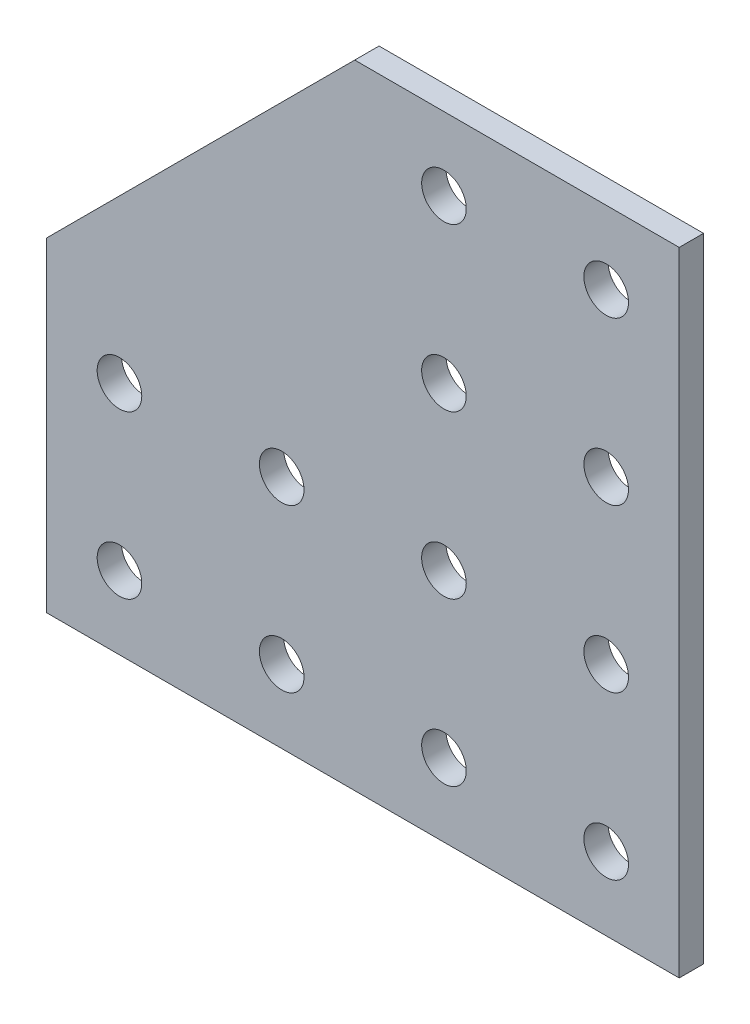
ISO-10303-21;
HEADER;
FILE_DESCRIPTION(('STEP AP214'),'2;1');
FILE_NAME('part.step','',(''),(''),'','','');
FILE_SCHEMA(('AUTOMOTIVE_DESIGN { 1 0 10303 214 1 1 1 1 }'));
ENDSEC;
DATA;
#1=APPLICATION_CONTEXT('core data for automotive mechanical design processes');
#2=APPLICATION_PROTOCOL_DEFINITION('international standard','automotive_design',2000,#1);
#3=PRODUCT_CONTEXT('',#1,'mechanical');
#4=PRODUCT('Part','Part','',(#3));
#5=PRODUCT_RELATED_PRODUCT_CATEGORY('part','',(#4));
#6=PRODUCT_DEFINITION_FORMATION('','',#4);
#7=PRODUCT_DEFINITION_CONTEXT('part definition',#1,'design');
#8=PRODUCT_DEFINITION('design','',#6,#7);
#9=PRODUCT_DEFINITION_SHAPE('','',#8);
#10=(LENGTH_UNIT() NAMED_UNIT(*) SI_UNIT(.MILLI.,.METRE.));
#11=(NAMED_UNIT(*) PLANE_ANGLE_UNIT() SI_UNIT($,.RADIAN.));
#12=(NAMED_UNIT(*) SI_UNIT($,.STERADIAN.) SOLID_ANGLE_UNIT());
#13=UNCERTAINTY_MEASURE_WITH_UNIT(LENGTH_MEASURE(1.E-05),#10,'distance_accuracy_value','');
#14=(GEOMETRIC_REPRESENTATION_CONTEXT(3) GLOBAL_UNCERTAINTY_ASSIGNED_CONTEXT((#13)) GLOBAL_UNIT_ASSIGNED_CONTEXT((#10,
#11,#12)) REPRESENTATION_CONTEXT('',''));
#15=CARTESIAN_POINT('',(0.,0.,0.));
#16=DIRECTION('',(0.,0.,1.));
#17=DIRECTION('',(1.,0.,0.));
#18=AXIS2_PLACEMENT_3D('',#15,#16,#17);
#19=CARTESIAN_POINT('',(0.,0.,3.));
#20=DIRECTION('',(0.,0.,-1.));
#21=DIRECTION('',(-1.,0.,0.));
#22=AXIS2_PLACEMENT_3D('',#19,#20,#21);
#23=PLANE('',#22);
#24=DIRECTION('',(1.,0.,0.));
#25=VECTOR('',#24,1.);
#26=CARTESIAN_POINT('',(78.,0.,3.));
#27=LINE('',#26,#25);
#28=CARTESIAN_POINT('',(0.,0.,3.));
#29=VERTEX_POINT('',#28);
#30=CARTESIAN_POINT('',(78.,0.,3.));
#31=VERTEX_POINT('',#30);
#32=EDGE_CURVE('E117',#29,#31,#27,.T.);
#33=ORIENTED_EDGE('',*,*,#32,.T.);
#34=DIRECTION('',(0.,1.,0.));
#35=VECTOR('',#34,1.);
#36=CARTESIAN_POINT('',(78.,78.,3.));
#37=LINE('',#36,#35);
#38=CARTESIAN_POINT('',(78.,78.,3.));
#39=VERTEX_POINT('',#38);
#40=EDGE_CURVE('E84',#31,#39,#37,.T.);
#41=ORIENTED_EDGE('',*,*,#40,.T.);
#42=DIRECTION('',(-1.,0.,0.));
#43=VECTOR('',#42,1.);
#44=CARTESIAN_POINT('',(38.,78.,3.));
#45=LINE('',#44,#43);
#46=CARTESIAN_POINT('',(38.,78.,3.));
#47=VERTEX_POINT('',#46);
#48=EDGE_CURVE('E88',#39,#47,#45,.T.);
#49=ORIENTED_EDGE('',*,*,#48,.T.);
#50=DIRECTION('',(-0.707106781186548,-0.707106781186548,0.));
#51=VECTOR('',#50,1.);
#52=CARTESIAN_POINT('',(0.,40.,3.));
#53=LINE('',#52,#51);
#54=CARTESIAN_POINT('',(0.,40.,3.));
#55=VERTEX_POINT('',#54);
#56=EDGE_CURVE('E92',#47,#55,#53,.T.);
#57=ORIENTED_EDGE('',*,*,#56,.T.);
#58=DIRECTION('',(0.,-1.,0.));
#59=VECTOR('',#58,1.);
#60=CARTESIAN_POINT('',(0.,0.,3.));
#61=LINE('',#60,#59);
#62=EDGE_CURVE('E50',#55,#29,#61,.T.);
#63=ORIENTED_EDGE('',*,*,#62,.T.);
#64=EDGE_LOOP('',(#33,#41,#49,#57,#63));
#65=FACE_BOUND('',#64,.T.);
#66=CARTESIAN_POINT('',(8.99999999999999,29.,3.));
#67=DIRECTION('',(0.,0.,1.));
#68=DIRECTION('',(1.,0.,0.));
#69=AXIS2_PLACEMENT_3D('',#66,#67,#68);
#70=CIRCLE('',#69,2.75);
#71=CARTESIAN_POINT('',(11.75,29.,3.));
#72=VERTEX_POINT('',#71);
#73=EDGE_CURVE('E112',#72,#72,#70,.T.);
#74=ORIENTED_EDGE('',*,*,#73,.F.);
#75=EDGE_LOOP('',(#74));
#76=FACE_BOUND('',#75,.T.);
#77=CARTESIAN_POINT('',(8.99999999999999,8.99999999999999,3.));
#78=DIRECTION('',(0.,0.,1.));
#79=DIRECTION('',(-1.,0.,0.));
#80=AXIS2_PLACEMENT_3D('',#77,#78,#79);
#81=CIRCLE('',#80,2.75);
#82=CARTESIAN_POINT('',(6.25,8.99999999999999,3.));
#83=VERTEX_POINT('',#82);
#84=EDGE_CURVE('E256',#83,#83,#81,.T.);
#85=ORIENTED_EDGE('',*,*,#84,.F.);
#86=EDGE_LOOP('',(#85));
#87=FACE_BOUND('',#86,.T.);
#88=CARTESIAN_POINT('',(29.,8.99999999999999,3.));
#89=DIRECTION('',(0.,0.,1.));
#90=DIRECTION('',(1.,0.,0.));
#91=AXIS2_PLACEMENT_3D('',#88,#89,#90);
#92=CIRCLE('',#91,2.75);
#93=CARTESIAN_POINT('',(31.75,8.99999999999999,3.));
#94=VERTEX_POINT('',#93);
#95=EDGE_CURVE('E250',#94,#94,#92,.T.);
#96=ORIENTED_EDGE('',*,*,#95,.F.);
#97=EDGE_LOOP('',(#96));
#98=FACE_BOUND('',#97,.T.);
#99=CARTESIAN_POINT('',(29.,29.,3.));
#100=DIRECTION('',(0.,0.,1.));
#101=DIRECTION('',(-1.,0.,0.));
#102=AXIS2_PLACEMENT_3D('',#99,#100,#101);
#103=CIRCLE('',#102,2.75);
#104=CARTESIAN_POINT('',(26.25,29.,3.));
#105=VERTEX_POINT('',#104);
#106=EDGE_CURVE('E244',#105,#105,#103,.T.);
#107=ORIENTED_EDGE('',*,*,#106,.F.);
#108=EDGE_LOOP('',(#107));
#109=FACE_BOUND('',#108,.T.);
#110=CARTESIAN_POINT('',(49.,29.,3.));
#111=DIRECTION('',(0.,0.,1.));
#112=DIRECTION('',(1.,0.,0.));
#113=AXIS2_PLACEMENT_3D('',#110,#111,#112);
#114=CIRCLE('',#113,2.74999999999999);
#115=CARTESIAN_POINT('',(51.75,29.,3.));
#116=VERTEX_POINT('',#115);
#117=EDGE_CURVE('E238',#116,#116,#114,.T.);
#118=ORIENTED_EDGE('',*,*,#117,.F.);
#119=EDGE_LOOP('',(#118));
#120=FACE_BOUND('',#119,.T.);
#121=CARTESIAN_POINT('',(49.,8.99999999999999,3.));
#122=DIRECTION('',(0.,0.,1.));
#123=DIRECTION('',(-1.,0.,0.));
#124=AXIS2_PLACEMENT_3D('',#121,#122,#123);
#125=CIRCLE('',#124,2.74999999999999);
#126=CARTESIAN_POINT('',(46.25,8.99999999999999,3.));
#127=VERTEX_POINT('',#126);
#128=EDGE_CURVE('E232',#127,#127,#125,.T.);
#129=ORIENTED_EDGE('',*,*,#128,.F.);
#130=EDGE_LOOP('',(#129));
#131=FACE_BOUND('',#130,.T.);
#132=CARTESIAN_POINT('',(69.,8.99999999999999,3.));
#133=DIRECTION('',(0.,0.,1.));
#134=DIRECTION('',(1.,0.,0.));
#135=AXIS2_PLACEMENT_3D('',#132,#133,#134);
#136=CIRCLE('',#135,2.74999999999999);
#137=CARTESIAN_POINT('',(71.75,8.99999999999999,3.));
#138=VERTEX_POINT('',#137);
#139=EDGE_CURVE('E226',#138,#138,#136,.T.);
#140=ORIENTED_EDGE('',*,*,#139,.F.);
#141=EDGE_LOOP('',(#140));
#142=FACE_BOUND('',#141,.T.);
#143=CARTESIAN_POINT('',(69.,29.,3.));
#144=DIRECTION('',(0.,0.,1.));
#145=DIRECTION('',(1.,0.,0.));
#146=AXIS2_PLACEMENT_3D('',#143,#144,#145);
#147=CIRCLE('',#146,2.75);
#148=CARTESIAN_POINT('',(71.75,29.,3.));
#149=VERTEX_POINT('',#148);
#150=EDGE_CURVE('E220',#149,#149,#147,.T.);
#151=ORIENTED_EDGE('',*,*,#150,.F.);
#152=EDGE_LOOP('',(#151));
#153=FACE_BOUND('',#152,.T.);
#154=CARTESIAN_POINT('',(49.,49.,3.));
#155=DIRECTION('',(0.,0.,1.));
#156=DIRECTION('',(1.,0.,0.));
#157=AXIS2_PLACEMENT_3D('',#154,#155,#156);
#158=CIRCLE('',#157,2.74999999999999);
#159=CARTESIAN_POINT('',(51.75,49.,3.));
#160=VERTEX_POINT('',#159);
#161=EDGE_CURVE('E214',#160,#160,#158,.T.);
#162=ORIENTED_EDGE('',*,*,#161,.F.);
#163=EDGE_LOOP('',(#162));
#164=FACE_BOUND('',#163,.T.);
#165=CARTESIAN_POINT('',(69.,49.,3.));
#166=DIRECTION('',(0.,0.,1.));
#167=DIRECTION('',(-1.,0.,0.));
#168=AXIS2_PLACEMENT_3D('',#165,#166,#167);
#169=CIRCLE('',#168,2.74999999999999);
#170=CARTESIAN_POINT('',(66.25,49.,3.));
#171=VERTEX_POINT('',#170);
#172=EDGE_CURVE('E208',#171,#171,#169,.T.);
#173=ORIENTED_EDGE('',*,*,#172,.F.);
#174=EDGE_LOOP('',(#173));
#175=FACE_BOUND('',#174,.T.);
#176=CARTESIAN_POINT('',(69.,69.,3.));
#177=DIRECTION('',(0.,0.,1.));
#178=DIRECTION('',(1.,0.,0.));
#179=AXIS2_PLACEMENT_3D('',#176,#177,#178);
#180=CIRCLE('',#179,2.74999999999998);
#181=CARTESIAN_POINT('',(71.75,69.,3.));
#182=VERTEX_POINT('',#181);
#183=EDGE_CURVE('E202',#182,#182,#180,.T.);
#184=ORIENTED_EDGE('',*,*,#183,.F.);
#185=EDGE_LOOP('',(#184));
#186=FACE_BOUND('',#185,.T.);
#187=CARTESIAN_POINT('',(49.,69.,3.));
#188=DIRECTION('',(0.,0.,1.));
#189=DIRECTION('',(-1.,0.,0.));
#190=AXIS2_PLACEMENT_3D('',#187,#188,#189);
#191=CIRCLE('',#190,2.75);
#192=CARTESIAN_POINT('',(46.25,69.,3.));
#193=VERTEX_POINT('',#192);
#194=EDGE_CURVE('E193',#193,#193,#191,.T.);
#195=ORIENTED_EDGE('',*,*,#194,.F.);
#196=EDGE_LOOP('',(#195));
#197=FACE_BOUND('',#196,.T.);
#198=ADVANCED_FACE('F33',(#65,#76,#87,#98,#109,#120,#131,#142,#153,#164,#175,#186,#197),#23,.F.);
#199=CARTESIAN_POINT('',(0.,0.,0.));
#200=DIRECTION('',(0.,0.,-1.));
#201=DIRECTION('',(-1.,0.,0.));
#202=AXIS2_PLACEMENT_3D('',#199,#200,#201);
#203=PLANE('',#202);
#204=CARTESIAN_POINT('',(69.,69.,0.));
#205=DIRECTION('',(0.,0.,1.));
#206=DIRECTION('',(1.,0.,0.));
#207=AXIS2_PLACEMENT_3D('',#204,#205,#206);
#208=CIRCLE('',#207,2.74999999999998);
#209=CARTESIAN_POINT('',(71.75,69.,0.));
#210=VERTEX_POINT('',#209);
#211=EDGE_CURVE('E199',#210,#210,#208,.T.);
#212=ORIENTED_EDGE('',*,*,#211,.T.);
#213=EDGE_LOOP('',(#212));
#214=FACE_BOUND('',#213,.T.);
#215=CARTESIAN_POINT('',(49.,49.,0.));
#216=DIRECTION('',(0.,0.,1.));
#217=DIRECTION('',(1.,0.,0.));
#218=AXIS2_PLACEMENT_3D('',#215,#216,#217);
#219=CIRCLE('',#218,2.74999999999999);
#220=CARTESIAN_POINT('',(51.75,49.,0.));
#221=VERTEX_POINT('',#220);
#222=EDGE_CURVE('E211',#221,#221,#219,.T.);
#223=ORIENTED_EDGE('',*,*,#222,.T.);
#224=EDGE_LOOP('',(#223));
#225=FACE_BOUND('',#224,.T.);
#226=CARTESIAN_POINT('',(69.,8.99999999999999,0.));
#227=DIRECTION('',(0.,0.,1.));
#228=DIRECTION('',(1.,0.,0.));
#229=AXIS2_PLACEMENT_3D('',#226,#227,#228);
#230=CIRCLE('',#229,2.74999999999999);
#231=CARTESIAN_POINT('',(71.75,8.99999999999999,0.));
#232=VERTEX_POINT('',#231);
#233=EDGE_CURVE('E223',#232,#232,#230,.T.);
#234=ORIENTED_EDGE('',*,*,#233,.T.);
#235=EDGE_LOOP('',(#234));
#236=FACE_BOUND('',#235,.T.);
#237=CARTESIAN_POINT('',(49.,29.,0.));
#238=DIRECTION('',(0.,0.,1.));
#239=DIRECTION('',(1.,0.,0.));
#240=AXIS2_PLACEMENT_3D('',#237,#238,#239);
#241=CIRCLE('',#240,2.74999999999999);
#242=CARTESIAN_POINT('',(51.75,29.,0.));
#243=VERTEX_POINT('',#242);
#244=EDGE_CURVE('E235',#243,#243,#241,.T.);
#245=ORIENTED_EDGE('',*,*,#244,.T.);
#246=EDGE_LOOP('',(#245));
#247=FACE_BOUND('',#246,.T.);
#248=CARTESIAN_POINT('',(29.,8.99999999999999,0.));
#249=DIRECTION('',(0.,0.,1.));
#250=DIRECTION('',(1.,0.,0.));
#251=AXIS2_PLACEMENT_3D('',#248,#249,#250);
#252=CIRCLE('',#251,2.75);
#253=CARTESIAN_POINT('',(31.75,8.99999999999999,0.));
#254=VERTEX_POINT('',#253);
#255=EDGE_CURVE('E247',#254,#254,#252,.T.);
#256=ORIENTED_EDGE('',*,*,#255,.T.);
#257=EDGE_LOOP('',(#256));
#258=FACE_BOUND('',#257,.T.);
#259=CARTESIAN_POINT('',(8.99999999999999,29.,0.));
#260=DIRECTION('',(0.,0.,1.));
#261=DIRECTION('',(1.,0.,0.));
#262=AXIS2_PLACEMENT_3D('',#259,#260,#261);
#263=CIRCLE('',#262,2.75);
#264=CARTESIAN_POINT('',(11.75,29.,0.));
#265=VERTEX_POINT('',#264);
#266=EDGE_CURVE('E259',#265,#265,#263,.T.);
#267=ORIENTED_EDGE('',*,*,#266,.T.);
#268=EDGE_LOOP('',(#267));
#269=FACE_BOUND('',#268,.T.);
#270=DIRECTION('',(1.,0.,0.));
#271=VECTOR('',#270,1.);
#272=CARTESIAN_POINT('',(78.,0.,0.));
#273=LINE('',#272,#271);
#274=CARTESIAN_POINT('',(0.,0.,0.));
#275=VERTEX_POINT('',#274);
#276=CARTESIAN_POINT('',(78.,0.,0.));
#277=VERTEX_POINT('',#276);
#278=EDGE_CURVE('E108',#275,#277,#273,.T.);
#279=ORIENTED_EDGE('',*,*,#278,.F.);
#280=DIRECTION('',(0.,-1.,0.));
#281=VECTOR('',#280,1.);
#282=CARTESIAN_POINT('',(0.,0.,0.));
#283=LINE('',#282,#281);
#284=CARTESIAN_POINT('',(0.,40.,0.));
#285=VERTEX_POINT('',#284);
#286=EDGE_CURVE('E76',#285,#275,#283,.T.);
#287=ORIENTED_EDGE('',*,*,#286,.F.);
#288=DIRECTION('',(-0.707106781186548,-0.707106781186548,0.));
#289=VECTOR('',#288,1.);
#290=CARTESIAN_POINT('',(0.,40.,0.));
#291=LINE('',#290,#289);
#292=CARTESIAN_POINT('',(38.,78.,0.));
#293=VERTEX_POINT('',#292);
#294=EDGE_CURVE('E70',#293,#285,#291,.T.);
#295=ORIENTED_EDGE('',*,*,#294,.F.);
#296=DIRECTION('',(-1.,0.,0.));
#297=VECTOR('',#296,1.);
#298=CARTESIAN_POINT('',(38.,78.,0.));
#299=LINE('',#298,#297);
#300=CARTESIAN_POINT('',(78.,78.,0.));
#301=VERTEX_POINT('',#300);
#302=EDGE_CURVE('E99',#301,#293,#299,.T.);
#303=ORIENTED_EDGE('',*,*,#302,.F.);
#304=DIRECTION('',(0.,1.,0.));
#305=VECTOR('',#304,1.);
#306=CARTESIAN_POINT('',(78.,78.,0.));
#307=LINE('',#306,#305);
#308=EDGE_CURVE('E111',#277,#301,#307,.T.);
#309=ORIENTED_EDGE('',*,*,#308,.F.);
#310=EDGE_LOOP('',(#279,#287,#295,#303,#309));
#311=FACE_BOUND('',#310,.T.);
#312=CARTESIAN_POINT('',(8.99999999999999,8.99999999999999,0.));
#313=DIRECTION('',(0.,0.,1.));
#314=DIRECTION('',(-1.,0.,0.));
#315=AXIS2_PLACEMENT_3D('',#312,#313,#314);
#316=CIRCLE('',#315,2.75);
#317=CARTESIAN_POINT('',(6.25,8.99999999999999,0.));
#318=VERTEX_POINT('',#317);
#319=EDGE_CURVE('E253',#318,#318,#316,.T.);
#320=ORIENTED_EDGE('',*,*,#319,.T.);
#321=EDGE_LOOP('',(#320));
#322=FACE_BOUND('',#321,.T.);
#323=CARTESIAN_POINT('',(29.,29.,0.));
#324=DIRECTION('',(0.,0.,1.));
#325=DIRECTION('',(-1.,0.,0.));
#326=AXIS2_PLACEMENT_3D('',#323,#324,#325);
#327=CIRCLE('',#326,2.75);
#328=CARTESIAN_POINT('',(26.25,29.,0.));
#329=VERTEX_POINT('',#328);
#330=EDGE_CURVE('E241',#329,#329,#327,.T.);
#331=ORIENTED_EDGE('',*,*,#330,.T.);
#332=EDGE_LOOP('',(#331));
#333=FACE_BOUND('',#332,.T.);
#334=CARTESIAN_POINT('',(49.,8.99999999999999,0.));
#335=DIRECTION('',(0.,0.,1.));
#336=DIRECTION('',(-1.,0.,0.));
#337=AXIS2_PLACEMENT_3D('',#334,#335,#336);
#338=CIRCLE('',#337,2.74999999999999);
#339=CARTESIAN_POINT('',(46.25,8.99999999999999,0.));
#340=VERTEX_POINT('',#339);
#341=EDGE_CURVE('E229',#340,#340,#338,.T.);
#342=ORIENTED_EDGE('',*,*,#341,.T.);
#343=EDGE_LOOP('',(#342));
#344=FACE_BOUND('',#343,.T.);
#345=CARTESIAN_POINT('',(69.,29.,0.));
#346=DIRECTION('',(0.,0.,1.));
#347=DIRECTION('',(1.,0.,0.));
#348=AXIS2_PLACEMENT_3D('',#345,#346,#347);
#349=CIRCLE('',#348,2.75);
#350=CARTESIAN_POINT('',(71.75,29.,0.));
#351=VERTEX_POINT('',#350);
#352=EDGE_CURVE('E217',#351,#351,#349,.T.);
#353=ORIENTED_EDGE('',*,*,#352,.T.);
#354=EDGE_LOOP('',(#353));
#355=FACE_BOUND('',#354,.T.);
#356=CARTESIAN_POINT('',(69.,49.,0.));
#357=DIRECTION('',(0.,0.,1.));
#358=DIRECTION('',(-1.,0.,0.));
#359=AXIS2_PLACEMENT_3D('',#356,#357,#358);
#360=CIRCLE('',#359,2.74999999999999);
#361=CARTESIAN_POINT('',(66.25,49.,0.));
#362=VERTEX_POINT('',#361);
#363=EDGE_CURVE('E205',#362,#362,#360,.T.);
#364=ORIENTED_EDGE('',*,*,#363,.T.);
#365=EDGE_LOOP('',(#364));
#366=FACE_BOUND('',#365,.T.);
#367=CARTESIAN_POINT('',(49.,69.,0.));
#368=DIRECTION('',(0.,0.,1.));
#369=DIRECTION('',(-1.,0.,0.));
#370=AXIS2_PLACEMENT_3D('',#367,#368,#369);
#371=CIRCLE('',#370,2.75);
#372=CARTESIAN_POINT('',(46.25,69.,0.));
#373=VERTEX_POINT('',#372);
#374=EDGE_CURVE('E196',#373,#373,#371,.T.);
#375=ORIENTED_EDGE('',*,*,#374,.T.);
#376=EDGE_LOOP('',(#375));
#377=FACE_BOUND('',#376,.T.);
#378=ADVANCED_FACE('F121',(#214,#225,#236,#247,#258,#269,#311,#322,#333,#344,#355,#366,#377),
#203,.T.);
#379=CARTESIAN_POINT('',(78.,0.,3.));
#380=DIRECTION('',(0.,1.,0.));
#381=DIRECTION('',(0.,0.,1.));
#382=AXIS2_PLACEMENT_3D('',#379,#380,#381);
#383=PLANE('',#382);
#384=ORIENTED_EDGE('',*,*,#278,.T.);
#385=DIRECTION('',(0.,0.,-1.));
#386=VECTOR('',#385,1.);
#387=CARTESIAN_POINT('',(78.,0.,3.));
#388=LINE('',#387,#386);
#389=EDGE_CURVE('E11',#31,#277,#388,.T.);
#390=ORIENTED_EDGE('',*,*,#389,.F.);
#391=ORIENTED_EDGE('',*,*,#32,.F.);
#392=DIRECTION('',(0.,0.,-1.));
#393=VECTOR('',#392,1.);
#394=CARTESIAN_POINT('',(0.,0.,3.));
#395=LINE('',#394,#393);
#396=EDGE_CURVE('E104',#29,#275,#395,.T.);
#397=ORIENTED_EDGE('',*,*,#396,.T.);
#398=EDGE_LOOP('',(#384,#390,#391,#397));
#399=FACE_BOUND('',#398,.T.);
#400=ADVANCED_FACE('F35',(#399),#383,.F.);
#401=CARTESIAN_POINT('',(78.,78.,3.));
#402=DIRECTION('',(-1.,0.,0.));
#403=DIRECTION('',(0.,0.,1.));
#404=AXIS2_PLACEMENT_3D('',#401,#402,#403);
#405=PLANE('',#404);
#406=ORIENTED_EDGE('',*,*,#308,.T.);
#407=DIRECTION('',(0.,0.,-1.));
#408=VECTOR('',#407,1.);
#409=CARTESIAN_POINT('',(78.,78.,3.));
#410=LINE('',#409,#408);
#411=EDGE_CURVE('E42',#39,#301,#410,.T.);
#412=ORIENTED_EDGE('',*,*,#411,.F.);
#413=ORIENTED_EDGE('',*,*,#40,.F.);
#414=ORIENTED_EDGE('',*,*,#389,.T.);
#415=EDGE_LOOP('',(#406,#412,#413,#414));
#416=FACE_BOUND('',#415,.T.);
#417=ADVANCED_FACE('F382',(#416),#405,.F.);
#418=CARTESIAN_POINT('',(38.,78.,3.));
#419=DIRECTION('',(0.,-1.,0.));
#420=DIRECTION('',(0.,0.,-1.));
#421=AXIS2_PLACEMENT_3D('',#418,#419,#420);
#422=PLANE('',#421);
#423=ORIENTED_EDGE('',*,*,#302,.T.);
#424=DIRECTION('',(0.,0.,-1.));
#425=VECTOR('',#424,1.);
#426=CARTESIAN_POINT('',(38.,78.,3.));
#427=LINE('',#426,#425);
#428=EDGE_CURVE('E96',#47,#293,#427,.T.);
#429=ORIENTED_EDGE('',*,*,#428,.F.);
#430=ORIENTED_EDGE('',*,*,#48,.F.);
#431=ORIENTED_EDGE('',*,*,#411,.T.);
#432=EDGE_LOOP('',(#423,#429,#430,#431));
#433=FACE_BOUND('',#432,.T.);
#434=ADVANCED_FACE('F97',(#433),#422,.F.);
#435=CARTESIAN_POINT('',(0.,40.,3.));
#436=DIRECTION('',(0.707106781186547,-0.707106781186548,0.));
#437=DIRECTION('',(0.707106781186548,0.707106781186547,0.));
#438=AXIS2_PLACEMENT_3D('',#435,#436,#437);
#439=PLANE('',#438);
#440=ORIENTED_EDGE('',*,*,#294,.T.);
#441=DIRECTION('',(0.,0.,-1.));
#442=VECTOR('',#441,1.);
#443=CARTESIAN_POINT('',(0.,40.,3.));
#444=LINE('',#443,#442);
#445=EDGE_CURVE('E100',#55,#285,#444,.T.);
#446=ORIENTED_EDGE('',*,*,#445,.F.);
#447=ORIENTED_EDGE('',*,*,#56,.F.);
#448=ORIENTED_EDGE('',*,*,#428,.T.);
#449=EDGE_LOOP('',(#440,#446,#447,#448));
#450=FACE_BOUND('',#449,.T.);
#451=ADVANCED_FACE('F102',(#450),#439,.F.);
#452=CARTESIAN_POINT('',(0.,0.,3.));
#453=DIRECTION('',(1.,0.,0.));
#454=DIRECTION('',(0.,0.,-1.));
#455=AXIS2_PLACEMENT_3D('',#452,#453,#454);
#456=PLANE('',#455);
#457=ORIENTED_EDGE('',*,*,#286,.T.);
#458=ORIENTED_EDGE('',*,*,#396,.F.);
#459=ORIENTED_EDGE('',*,*,#62,.F.);
#460=ORIENTED_EDGE('',*,*,#445,.T.);
#461=EDGE_LOOP('',(#457,#458,#459,#460));
#462=FACE_BOUND('',#461,.T.);
#463=ADVANCED_FACE('F126',(#462),#456,.F.);
#464=CARTESIAN_POINT('',(8.99999999999999,29.,3.));
#465=DIRECTION('',(0.,0.,-1.));
#466=DIRECTION('',(-1.,0.,0.));
#467=AXIS2_PLACEMENT_3D('',#464,#465,#466);
#468=CYLINDRICAL_SURFACE('',#467,2.75);
#469=ORIENTED_EDGE('',*,*,#73,.T.);
#470=EDGE_LOOP('',(#469));
#471=FACE_BOUND('',#470,.T.);
#472=ORIENTED_EDGE('',*,*,#266,.F.);
#473=EDGE_LOOP('',(#472));
#474=FACE_BOUND('',#473,.T.);
#475=ADVANCED_FACE('F128',(#471,#474),#468,.F.);
#476=CARTESIAN_POINT('',(8.99999999999999,8.99999999999999,3.));
#477=DIRECTION('',(0.,0.,-1.));
#478=DIRECTION('',(-1.,0.,0.));
#479=AXIS2_PLACEMENT_3D('',#476,#477,#478);
#480=CYLINDRICAL_SURFACE('',#479,2.75);
#481=ORIENTED_EDGE('',*,*,#84,.T.);
#482=EDGE_LOOP('',(#481));
#483=FACE_BOUND('',#482,.T.);
#484=ORIENTED_EDGE('',*,*,#319,.F.);
#485=EDGE_LOOP('',(#484));
#486=FACE_BOUND('',#485,.T.);
#487=ADVANCED_FACE('F134',(#483,#486),#480,.F.);
#488=CARTESIAN_POINT('',(29.,8.99999999999999,3.));
#489=DIRECTION('',(0.,0.,-1.));
#490=DIRECTION('',(-1.,0.,0.));
#491=AXIS2_PLACEMENT_3D('',#488,#489,#490);
#492=CYLINDRICAL_SURFACE('',#491,2.75);
#493=ORIENTED_EDGE('',*,*,#95,.T.);
#494=EDGE_LOOP('',(#493));
#495=FACE_BOUND('',#494,.T.);
#496=ORIENTED_EDGE('',*,*,#255,.F.);
#497=EDGE_LOOP('',(#496));
#498=FACE_BOUND('',#497,.T.);
#499=ADVANCED_FACE('F148',(#495,#498),#492,.F.);
#500=CARTESIAN_POINT('',(29.,29.,3.));
#501=DIRECTION('',(0.,0.,-1.));
#502=DIRECTION('',(-1.,0.,0.));
#503=AXIS2_PLACEMENT_3D('',#500,#501,#502);
#504=CYLINDRICAL_SURFACE('',#503,2.75);
#505=ORIENTED_EDGE('',*,*,#106,.T.);
#506=EDGE_LOOP('',(#505));
#507=FACE_BOUND('',#506,.T.);
#508=ORIENTED_EDGE('',*,*,#330,.F.);
#509=EDGE_LOOP('',(#508));
#510=FACE_BOUND('',#509,.T.);
#511=ADVANCED_FACE('F152',(#507,#510),#504,.F.);
#512=CARTESIAN_POINT('',(49.,29.,3.));
#513=DIRECTION('',(0.,0.,-1.));
#514=DIRECTION('',(-1.,0.,0.));
#515=AXIS2_PLACEMENT_3D('',#512,#513,#514);
#516=CYLINDRICAL_SURFACE('',#515,2.74999999999999);
#517=ORIENTED_EDGE('',*,*,#117,.T.);
#518=EDGE_LOOP('',(#517));
#519=FACE_BOUND('',#518,.T.);
#520=ORIENTED_EDGE('',*,*,#244,.F.);
#521=EDGE_LOOP('',(#520));
#522=FACE_BOUND('',#521,.T.);
#523=ADVANCED_FACE('F156',(#519,#522),#516,.F.);
#524=CARTESIAN_POINT('',(49.,8.99999999999999,3.));
#525=DIRECTION('',(0.,0.,-1.));
#526=DIRECTION('',(-1.,0.,0.));
#527=AXIS2_PLACEMENT_3D('',#524,#525,#526);
#528=CYLINDRICAL_SURFACE('',#527,2.74999999999999);
#529=ORIENTED_EDGE('',*,*,#128,.T.);
#530=EDGE_LOOP('',(#529));
#531=FACE_BOUND('',#530,.T.);
#532=ORIENTED_EDGE('',*,*,#341,.F.);
#533=EDGE_LOOP('',(#532));
#534=FACE_BOUND('',#533,.T.);
#535=ADVANCED_FACE('F160',(#531,#534),#528,.F.);
#536=CARTESIAN_POINT('',(69.,8.99999999999999,3.));
#537=DIRECTION('',(0.,0.,-1.));
#538=DIRECTION('',(-1.,0.,0.));
#539=AXIS2_PLACEMENT_3D('',#536,#537,#538);
#540=CYLINDRICAL_SURFACE('',#539,2.74999999999999);
#541=ORIENTED_EDGE('',*,*,#139,.T.);
#542=EDGE_LOOP('',(#541));
#543=FACE_BOUND('',#542,.T.);
#544=ORIENTED_EDGE('',*,*,#233,.F.);
#545=EDGE_LOOP('',(#544));
#546=FACE_BOUND('',#545,.T.);
#547=ADVANCED_FACE('F164',(#543,#546),#540,.F.);
#548=CARTESIAN_POINT('',(69.,29.,3.));
#549=DIRECTION('',(0.,0.,-1.));
#550=DIRECTION('',(-1.,0.,0.));
#551=AXIS2_PLACEMENT_3D('',#548,#549,#550);
#552=CYLINDRICAL_SURFACE('',#551,2.75);
#553=ORIENTED_EDGE('',*,*,#150,.T.);
#554=EDGE_LOOP('',(#553));
#555=FACE_BOUND('',#554,.T.);
#556=ORIENTED_EDGE('',*,*,#352,.F.);
#557=EDGE_LOOP('',(#556));
#558=FACE_BOUND('',#557,.T.);
#559=ADVANCED_FACE('F168',(#555,#558),#552,.F.);
#560=CARTESIAN_POINT('',(49.,49.,3.));
#561=DIRECTION('',(0.,0.,-1.));
#562=DIRECTION('',(-1.,0.,0.));
#563=AXIS2_PLACEMENT_3D('',#560,#561,#562);
#564=CYLINDRICAL_SURFACE('',#563,2.74999999999999);
#565=ORIENTED_EDGE('',*,*,#161,.T.);
#566=EDGE_LOOP('',(#565));
#567=FACE_BOUND('',#566,.T.);
#568=ORIENTED_EDGE('',*,*,#222,.F.);
#569=EDGE_LOOP('',(#568));
#570=FACE_BOUND('',#569,.T.);
#571=ADVANCED_FACE('F172',(#567,#570),#564,.F.);
#572=CARTESIAN_POINT('',(69.,49.,3.));
#573=DIRECTION('',(0.,0.,-1.));
#574=DIRECTION('',(-1.,0.,0.));
#575=AXIS2_PLACEMENT_3D('',#572,#573,#574);
#576=CYLINDRICAL_SURFACE('',#575,2.74999999999999);
#577=ORIENTED_EDGE('',*,*,#172,.T.);
#578=EDGE_LOOP('',(#577));
#579=FACE_BOUND('',#578,.T.);
#580=ORIENTED_EDGE('',*,*,#363,.F.);
#581=EDGE_LOOP('',(#580));
#582=FACE_BOUND('',#581,.T.);
#583=ADVANCED_FACE('F176',(#579,#582),#576,.F.);
#584=CARTESIAN_POINT('',(69.,69.,3.));
#585=DIRECTION('',(0.,0.,-1.));
#586=DIRECTION('',(-1.,0.,0.));
#587=AXIS2_PLACEMENT_3D('',#584,#585,#586);
#588=CYLINDRICAL_SURFACE('',#587,2.74999999999998);
#589=ORIENTED_EDGE('',*,*,#183,.T.);
#590=EDGE_LOOP('',(#589));
#591=FACE_BOUND('',#590,.T.);
#592=ORIENTED_EDGE('',*,*,#211,.F.);
#593=EDGE_LOOP('',(#592));
#594=FACE_BOUND('',#593,.T.);
#595=ADVANCED_FACE('F180',(#591,#594),#588,.F.);
#596=CARTESIAN_POINT('',(49.,69.,3.));
#597=DIRECTION('',(0.,0.,-1.));
#598=DIRECTION('',(-1.,0.,0.));
#599=AXIS2_PLACEMENT_3D('',#596,#597,#598);
#600=CYLINDRICAL_SURFACE('',#599,2.75);
#601=ORIENTED_EDGE('',*,*,#194,.T.);
#602=EDGE_LOOP('',(#601));
#603=FACE_BOUND('',#602,.T.);
#604=ORIENTED_EDGE('',*,*,#374,.F.);
#605=EDGE_LOOP('',(#604));
#606=FACE_BOUND('',#605,.T.);
#607=ADVANCED_FACE('F184',(#603,#606),#600,.F.);
#608=CLOSED_SHELL('',(#198,#378,#400,#417,#434,#451,#463,#475,#487,#499,#511,#523,#535,#547,
#559,#571,#583,#595,#607));
#609=MANIFOLD_SOLID_BREP('B2',#608);
#610=ADVANCED_BREP_SHAPE_REPRESENTATION('',(#18,#609),#14);
#611=SHAPE_DEFINITION_REPRESENTATION(#9,#610);
ENDSEC;
END-ISO-10303-21;
